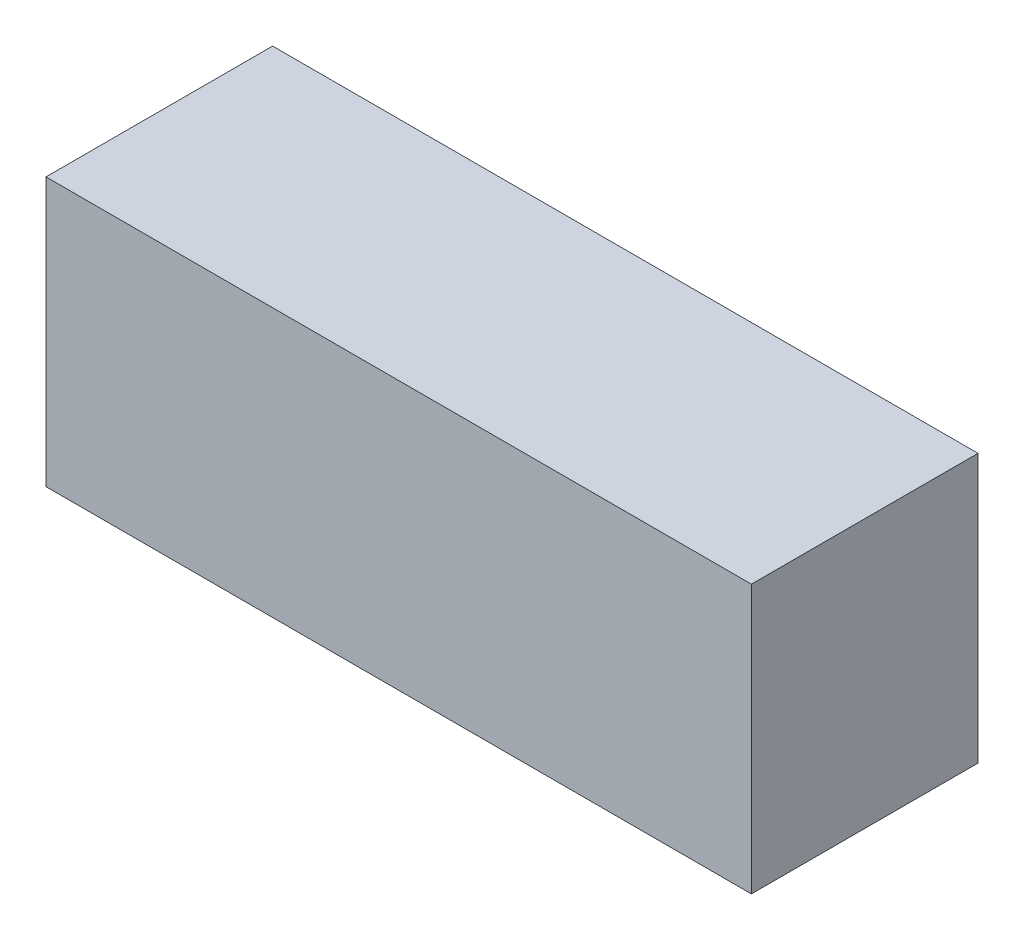
ISO-10303-21;
HEADER;
FILE_DESCRIPTION(('STEP AP214'),'2;1');
FILE_NAME('part.step','',(''),(''),'','','');
FILE_SCHEMA(('AUTOMOTIVE_DESIGN { 1 0 10303 214 1 1 1 1 }'));
ENDSEC;
DATA;
#1=APPLICATION_CONTEXT('core data for automotive mechanical design processes');
#2=APPLICATION_PROTOCOL_DEFINITION('international standard','automotive_design',2000,#1);
#3=PRODUCT_CONTEXT('',#1,'mechanical');
#4=PRODUCT('Part','Part','',(#3));
#5=PRODUCT_RELATED_PRODUCT_CATEGORY('part','',(#4));
#6=PRODUCT_DEFINITION_FORMATION('','',#4);
#7=PRODUCT_DEFINITION_CONTEXT('part definition',#1,'design');
#8=PRODUCT_DEFINITION('design','',#6,#7);
#9=PRODUCT_DEFINITION_SHAPE('','',#8);
#10=(LENGTH_UNIT() NAMED_UNIT(*) SI_UNIT(.MILLI.,.METRE.));
#11=(NAMED_UNIT(*) PLANE_ANGLE_UNIT() SI_UNIT($,.RADIAN.));
#12=(NAMED_UNIT(*) SI_UNIT($,.STERADIAN.) SOLID_ANGLE_UNIT());
#13=UNCERTAINTY_MEASURE_WITH_UNIT(LENGTH_MEASURE(1.E-05),#10,'distance_accuracy_value','');
#14=(GEOMETRIC_REPRESENTATION_CONTEXT(3) GLOBAL_UNCERTAINTY_ASSIGNED_CONTEXT((#13)) GLOBAL_UNIT_ASSIGNED_CONTEXT((#10,
#11,#12)) REPRESENTATION_CONTEXT('',''));
#15=CARTESIAN_POINT('',(0.,0.,0.));
#16=DIRECTION('',(0.,0.,1.));
#17=DIRECTION('',(1.,0.,0.));
#18=AXIS2_PLACEMENT_3D('',#15,#16,#17);
#19=CARTESIAN_POINT('',(-1.3699998,1.4732,2.54));
#20=DIRECTION('',(1.,0.,0.));
#21=DIRECTION('',(0.,0.,-1.));
#22=AXIS2_PLACEMENT_3D('',#19,#20,#21);
#23=PLANE('',#22);
#24=DIRECTION('',(0.,-1.,0.));
#25=VECTOR('',#24,1.);
#26=CARTESIAN_POINT('',(-1.3699998,1.4732,0.));
#27=LINE('',#26,#25);
#28=CARTESIAN_POINT('',(-1.3699998,1.4732,0.));
#29=VERTEX_POINT('',#28);
#30=CARTESIAN_POINT('',(-1.3699998,-1.5339822,0.));
#31=VERTEX_POINT('',#30);
#32=EDGE_CURVE('E95',#29,#31,#27,.T.);
#33=ORIENTED_EDGE('',*,*,#32,.T.);
#34=DIRECTION('',(0.,0.,-1.));
#35=VECTOR('',#34,1.);
#36=CARTESIAN_POINT('',(-1.3699998,-1.5339822,2.54));
#37=LINE('',#36,#35);
#38=CARTESIAN_POINT('',(-1.3699998,-1.5339822,2.54));
#39=VERTEX_POINT('',#38);
#40=EDGE_CURVE('E11',#39,#31,#37,.T.);
#41=ORIENTED_EDGE('',*,*,#40,.F.);
#42=DIRECTION('',(0.,-1.,0.));
#43=VECTOR('',#42,1.);
#44=CARTESIAN_POINT('',(-1.3699998,1.4732,2.54));
#45=LINE('',#44,#43);
#46=CARTESIAN_POINT('',(-1.3699998,1.4732,2.54));
#47=VERTEX_POINT('',#46);
#48=EDGE_CURVE('E83',#47,#39,#45,.T.);
#49=ORIENTED_EDGE('',*,*,#48,.F.);
#50=DIRECTION('',(0.,0.,-1.));
#51=VECTOR('',#50,1.);
#52=CARTESIAN_POINT('',(-1.3699998,1.4732,2.54));
#53=LINE('',#52,#51);
#54=EDGE_CURVE('E91',#47,#29,#53,.T.);
#55=ORIENTED_EDGE('',*,*,#54,.T.);
#56=EDGE_LOOP('',(#33,#41,#49,#55));
#57=FACE_BOUND('',#56,.T.);
#58=ADVANCED_FACE('F32',(#57),#23,.F.);
#59=CARTESIAN_POINT('',(-1.3699998,-1.5339822,2.54));
#60=DIRECTION('',(0.,1.,0.));
#61=DIRECTION('',(0.,0.,1.));
#62=AXIS2_PLACEMENT_3D('',#59,#60,#61);
#63=PLANE('',#62);
#64=DIRECTION('',(1.,0.,0.));
#65=VECTOR('',#64,1.);
#66=CARTESIAN_POINT('',(-1.3699998,-1.5339822,0.));
#67=LINE('',#66,#65);
#68=CARTESIAN_POINT('',(6.5368678,-1.5339822,0.));
#69=VERTEX_POINT('',#68);
#70=EDGE_CURVE('E87',#31,#69,#67,.T.);
#71=ORIENTED_EDGE('',*,*,#70,.T.);
#72=DIRECTION('',(0.,0.,-1.));
#73=VECTOR('',#72,1.);
#74=CARTESIAN_POINT('',(6.5368678,-1.5339822,2.54));
#75=LINE('',#74,#73);
#76=CARTESIAN_POINT('',(6.5368678,-1.5339822,2.54));
#77=VERTEX_POINT('',#76);
#78=EDGE_CURVE('E40',#77,#69,#75,.T.);
#79=ORIENTED_EDGE('',*,*,#78,.F.);
#80=DIRECTION('',(1.,0.,0.));
#81=VECTOR('',#80,1.);
#82=CARTESIAN_POINT('',(-1.3699998,-1.5339822,2.54));
#83=LINE('',#82,#81);
#84=EDGE_CURVE('E78',#39,#77,#83,.T.);
#85=ORIENTED_EDGE('',*,*,#84,.F.);
#86=ORIENTED_EDGE('',*,*,#40,.T.);
#87=EDGE_LOOP('',(#71,#79,#85,#86));
#88=FACE_BOUND('',#87,.T.);
#89=ADVANCED_FACE('F86',(#88),#63,.F.);
#90=CARTESIAN_POINT('',(6.5368678,-1.5339822,2.54));
#91=DIRECTION('',(-1.,0.,0.));
#92=DIRECTION('',(0.,0.,1.));
#93=AXIS2_PLACEMENT_3D('',#90,#91,#92);
#94=PLANE('',#93);
#95=DIRECTION('',(0.,1.,0.));
#96=VECTOR('',#95,1.);
#97=CARTESIAN_POINT('',(6.5368678,-1.5339822,0.));
#98=LINE('',#97,#96);
#99=CARTESIAN_POINT('',(6.5368678,1.4732,0.));
#100=VERTEX_POINT('',#99);
#101=EDGE_CURVE('E65',#69,#100,#98,.T.);
#102=ORIENTED_EDGE('',*,*,#101,.T.);
#103=DIRECTION('',(0.,0.,-1.));
#104=VECTOR('',#103,1.);
#105=CARTESIAN_POINT('',(6.5368678,1.4732,2.54));
#106=LINE('',#105,#104);
#107=CARTESIAN_POINT('',(6.5368678,1.4732,2.54));
#108=VERTEX_POINT('',#107);
#109=EDGE_CURVE('E88',#108,#100,#106,.T.);
#110=ORIENTED_EDGE('',*,*,#109,.F.);
#111=DIRECTION('',(0.,1.,0.));
#112=VECTOR('',#111,1.);
#113=CARTESIAN_POINT('',(6.5368678,-1.5339822,2.54));
#114=LINE('',#113,#112);
#115=EDGE_CURVE('E81',#77,#108,#114,.T.);
#116=ORIENTED_EDGE('',*,*,#115,.F.);
#117=ORIENTED_EDGE('',*,*,#78,.T.);
#118=EDGE_LOOP('',(#102,#110,#116,#117));
#119=FACE_BOUND('',#118,.T.);
#120=ADVANCED_FACE('F89',(#119),#94,.F.);
#121=CARTESIAN_POINT('',(6.5368678,1.4732,2.54));
#122=DIRECTION('',(0.,-1.,0.));
#123=DIRECTION('',(0.,0.,-1.));
#124=AXIS2_PLACEMENT_3D('',#121,#122,#123);
#125=PLANE('',#124);
#126=DIRECTION('',(-1.,0.,0.));
#127=VECTOR('',#126,1.);
#128=CARTESIAN_POINT('',(6.5368678,1.4732,0.));
#129=LINE('',#128,#127);
#130=EDGE_CURVE('E71',#100,#29,#129,.T.);
#131=ORIENTED_EDGE('',*,*,#130,.T.);
#132=ORIENTED_EDGE('',*,*,#54,.F.);
#133=DIRECTION('',(-1.,0.,0.));
#134=VECTOR('',#133,1.);
#135=CARTESIAN_POINT('',(6.5368678,1.4732,2.54));
#136=LINE('',#135,#134);
#137=EDGE_CURVE('E48',#108,#47,#136,.T.);
#138=ORIENTED_EDGE('',*,*,#137,.F.);
#139=ORIENTED_EDGE('',*,*,#109,.T.);
#140=EDGE_LOOP('',(#131,#132,#138,#139));
#141=FACE_BOUND('',#140,.T.);
#142=ADVANCED_FACE('F102',(#141),#125,.F.);
#143=CARTESIAN_POINT('',(0.,0.,2.54));
#144=DIRECTION('',(0.,0.,1.));
#145=DIRECTION('',(1.,0.,0.));
#146=AXIS2_PLACEMENT_3D('',#143,#144,#145);
#147=PLANE('',#146);
#148=ORIENTED_EDGE('',*,*,#48,.T.);
#149=ORIENTED_EDGE('',*,*,#84,.T.);
#150=ORIENTED_EDGE('',*,*,#115,.T.);
#151=ORIENTED_EDGE('',*,*,#137,.T.);
#152=EDGE_LOOP('',(#148,#149,#150,#151));
#153=FACE_BOUND('',#152,.T.);
#154=ADVANCED_FACE('F79',(#153),#147,.T.);
#155=CARTESIAN_POINT('',(0.,0.,0.));
#156=DIRECTION('',(0.,0.,1.));
#157=DIRECTION('',(1.,0.,0.));
#158=AXIS2_PLACEMENT_3D('',#155,#156,#157);
#159=PLANE('',#158);
#160=ORIENTED_EDGE('',*,*,#32,.F.);
#161=ORIENTED_EDGE('',*,*,#130,.F.);
#162=ORIENTED_EDGE('',*,*,#101,.F.);
#163=ORIENTED_EDGE('',*,*,#70,.F.);
#164=EDGE_LOOP('',(#160,#161,#162,#163));
#165=FACE_BOUND('',#164,.T.);
#166=ADVANCED_FACE('F105',(#165),#159,.F.);
#167=CLOSED_SHELL('',(#58,#89,#120,#142,#154,#166));
#168=MANIFOLD_SOLID_BREP('B2',#167);
#169=ADVANCED_BREP_SHAPE_REPRESENTATION('',(#18,#168),#14);
#170=SHAPE_DEFINITION_REPRESENTATION(#9,#169);
ENDSEC;
END-ISO-10303-21;
